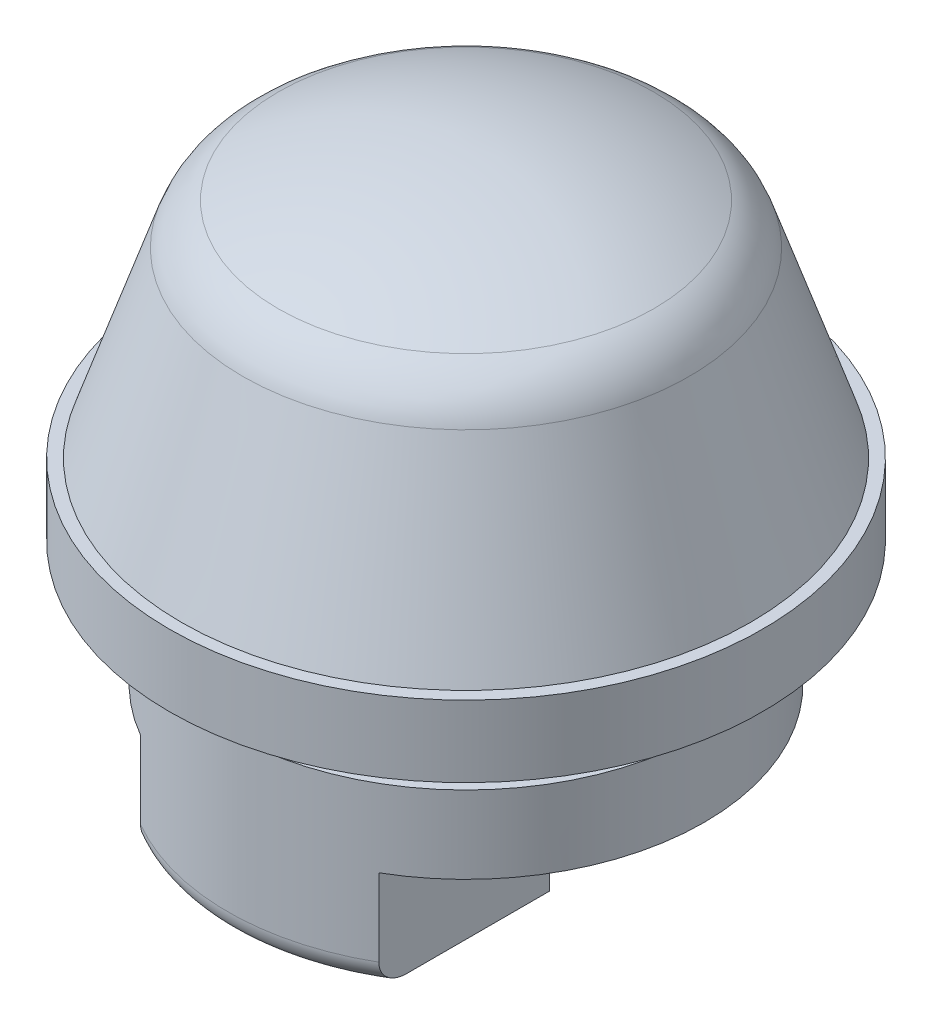
ISO-10303-21;
HEADER;
FILE_DESCRIPTION(('STEP AP214'),'2;1');
FILE_NAME('part.step','',(''),(''),'','','');
FILE_SCHEMA(('AUTOMOTIVE_DESIGN { 1 0 10303 214 1 1 1 1 }'));
ENDSEC;
DATA;
#1=APPLICATION_CONTEXT('core data for automotive mechanical design processes');
#2=APPLICATION_PROTOCOL_DEFINITION('international standard','automotive_design',2000,#1);
#3=PRODUCT_CONTEXT('',#1,'mechanical');
#4=PRODUCT('Part','Part','',(#3));
#5=PRODUCT_RELATED_PRODUCT_CATEGORY('part','',(#4));
#6=PRODUCT_DEFINITION_FORMATION('','',#4);
#7=PRODUCT_DEFINITION_CONTEXT('part definition',#1,'design');
#8=PRODUCT_DEFINITION('design','',#6,#7);
#9=PRODUCT_DEFINITION_SHAPE('','',#8);
#10=(LENGTH_UNIT() NAMED_UNIT(*) SI_UNIT(.MILLI.,.METRE.));
#11=(NAMED_UNIT(*) PLANE_ANGLE_UNIT() SI_UNIT($,.RADIAN.));
#12=(NAMED_UNIT(*) SI_UNIT($,.STERADIAN.) SOLID_ANGLE_UNIT());
#13=UNCERTAINTY_MEASURE_WITH_UNIT(LENGTH_MEASURE(1.E-05),#10,'distance_accuracy_value','');
#14=(GEOMETRIC_REPRESENTATION_CONTEXT(3) GLOBAL_UNCERTAINTY_ASSIGNED_CONTEXT((#13)) GLOBAL_UNIT_ASSIGNED_CONTEXT((#10,
#11,#12)) REPRESENTATION_CONTEXT('',''));
#15=CARTESIAN_POINT('',(0.,0.,0.));
#16=DIRECTION('',(0.,0.,1.));
#17=DIRECTION('',(1.,0.,0.));
#18=AXIS2_PLACEMENT_3D('',#15,#16,#17);
#19=CARTESIAN_POINT('',(0.,-10.5,0.));
#20=DIRECTION('',(0.,-1.,0.));
#21=DIRECTION('',(0.,0.,-1.));
#22=AXIS2_PLACEMENT_3D('',#19,#20,#21);
#23=CYLINDRICAL_SURFACE('',#22,5.6);
#24=CARTESIAN_POINT('',(0.,-16.,0.));
#25=DIRECTION('',(0.,-1.,0.));
#26=DIRECTION('',(0.,0.,-1.));
#27=AXIS2_PLACEMENT_3D('',#24,#25,#26);
#28=CIRCLE('',#27,5.6);
#29=CARTESIAN_POINT('',(-4.72863616701475,-16.,3.));
#30=VERTEX_POINT('',#29);
#31=CARTESIAN_POINT('',(4.72863616701475,-16.,3.));
#32=VERTEX_POINT('',#31);
#33=EDGE_CURVE('E416',#30,#32,#28,.F.);
#34=ORIENTED_EDGE('',*,*,#33,.F.);
#35=DIRECTION('',(0.,-1.,0.));
#36=VECTOR('',#35,1.);
#37=CARTESIAN_POINT('',(-4.72863616701475,-10.5,3.));
#38=LINE('',#37,#36);
#39=CARTESIAN_POINT('',(-4.72863616701475,-10.5,3.));
#40=VERTEX_POINT('',#39);
#41=EDGE_CURVE('E203',#40,#30,#38,.T.);
#42=ORIENTED_EDGE('',*,*,#41,.F.);
#43=CARTESIAN_POINT('',(0.,-10.5,0.));
#44=DIRECTION('',(0.,-1.,0.));
#45=DIRECTION('',(0.,0.,-1.));
#46=AXIS2_PLACEMENT_3D('',#43,#44,#45);
#47=CIRCLE('',#46,5.6);
#48=CARTESIAN_POINT('',(4.72863616701475,-10.5,3.));
#49=VERTEX_POINT('',#48);
#50=EDGE_CURVE('E414',#49,#40,#47,.T.);
#51=ORIENTED_EDGE('',*,*,#50,.F.);
#52=DIRECTION('',(0.,-1.,0.));
#53=VECTOR('',#52,1.);
#54=CARTESIAN_POINT('',(4.72863616701475,-10.5,3.));
#55=LINE('',#54,#53);
#56=EDGE_CURVE('E206',#49,#32,#55,.T.);
#57=ORIENTED_EDGE('',*,*,#56,.T.);
#58=EDGE_LOOP('',(#34,#42,#51,#57));
#59=FACE_BOUND('',#58,.T.);
#60=ADVANCED_FACE('F36',(#59),#23,.F.);
#61=CARTESIAN_POINT('',(0.,-10.5,0.));
#62=DIRECTION('',(0.,-1.,0.));
#63=DIRECTION('',(0.,0.,-1.));
#64=AXIS2_PLACEMENT_3D('',#61,#62,#63);
#65=CYLINDRICAL_SURFACE('',#64,5.6);
#66=CARTESIAN_POINT('',(0.,-16.,0.));
#67=DIRECTION('',(0.,-1.,0.));
#68=DIRECTION('',(0.,0.,-1.));
#69=AXIS2_PLACEMENT_3D('',#66,#67,#68);
#70=CIRCLE('',#69,5.6);
#71=CARTESIAN_POINT('',(4.72863616701475,-16.,-3.));
#72=VERTEX_POINT('',#71);
#73=CARTESIAN_POINT('',(-4.72863616701476,-16.,-3.));
#74=VERTEX_POINT('',#73);
#75=EDGE_CURVE('E278',#72,#74,#70,.F.);
#76=ORIENTED_EDGE('',*,*,#75,.F.);
#77=DIRECTION('',(0.,-1.,0.));
#78=VECTOR('',#77,1.);
#79=CARTESIAN_POINT('',(4.72863616701475,-10.5,-3.));
#80=LINE('',#79,#78);
#81=CARTESIAN_POINT('',(4.72863616701475,-10.5,-3.));
#82=VERTEX_POINT('',#81);
#83=EDGE_CURVE('E209',#82,#72,#80,.T.);
#84=ORIENTED_EDGE('',*,*,#83,.F.);
#85=CARTESIAN_POINT('',(0.,-10.5,0.));
#86=DIRECTION('',(0.,-1.,0.));
#87=DIRECTION('',(0.,0.,-1.));
#88=AXIS2_PLACEMENT_3D('',#85,#86,#87);
#89=CIRCLE('',#88,5.6);
#90=CARTESIAN_POINT('',(-4.72863616701476,-10.5,-3.));
#91=VERTEX_POINT('',#90);
#92=EDGE_CURVE('E406',#91,#82,#89,.T.);
#93=ORIENTED_EDGE('',*,*,#92,.F.);
#94=DIRECTION('',(0.,-1.,0.));
#95=VECTOR('',#94,1.);
#96=CARTESIAN_POINT('',(-4.72863616701476,-10.5,-3.));
#97=LINE('',#96,#95);
#98=EDGE_CURVE('E211',#91,#74,#97,.T.);
#99=ORIENTED_EDGE('',*,*,#98,.T.);
#100=EDGE_LOOP('',(#76,#84,#93,#99));
#101=FACE_BOUND('',#100,.T.);
#102=ADVANCED_FACE('F349',(#101),#65,.F.);
#103=CARTESIAN_POINT('',(0.,-19.,0.));
#104=DIRECTION('',(0.,-1.,0.));
#105=DIRECTION('',(0.,0.,-1.));
#106=AXIS2_PLACEMENT_3D('',#103,#104,#105);
#107=PLANE('',#106);
#108=DIRECTION('',(0.,0.,-1.));
#109=VECTOR('',#108,1.);
#110=CARTESIAN_POINT('',(10.,-19.,17.3205080756888));
#111=LINE('',#110,#109);
#112=CARTESIAN_POINT('',(10.,-19.,14.9666295470958));
#113=VERTEX_POINT('',#112);
#114=CARTESIAN_POINT('',(10.,-19.,3.));
#115=VERTEX_POINT('',#114);
#116=EDGE_CURVE('E233',#113,#115,#111,.T.);
#117=ORIENTED_EDGE('',*,*,#116,.F.);
#118=CARTESIAN_POINT('',(0.,-19.,0.));
#119=DIRECTION('',(0.,-1.,0.));
#120=DIRECTION('',(0.,0.,-1.));
#121=AXIS2_PLACEMENT_3D('',#118,#119,#120);
#122=CIRCLE('',#121,18.);
#123=CARTESIAN_POINT('',(-10.,-19.,14.9666295470958));
#124=VERTEX_POINT('',#123);
#125=EDGE_CURVE('E283',#113,#124,#122,.T.);
#126=ORIENTED_EDGE('',*,*,#125,.T.);
#127=DIRECTION('',(0.,0.,1.));
#128=VECTOR('',#127,1.);
#129=CARTESIAN_POINT('',(-10.,-19.,17.3205080756888));
#130=LINE('',#129,#128);
#131=CARTESIAN_POINT('',(-10.,-19.,3.));
#132=VERTEX_POINT('',#131);
#133=EDGE_CURVE('E222',#132,#124,#130,.T.);
#134=ORIENTED_EDGE('',*,*,#133,.F.);
#135=DIRECTION('',(-1.,0.,0.));
#136=VECTOR('',#135,1.);
#137=CARTESIAN_POINT('',(-4.72863616701475,-19.,3.));
#138=LINE('',#137,#136);
#139=CARTESIAN_POINT('',(-6.43506021727847,-19.,3.));
#140=VERTEX_POINT('',#139);
#141=EDGE_CURVE('E196',#140,#132,#138,.T.);
#142=ORIENTED_EDGE('',*,*,#141,.F.);
#143=CARTESIAN_POINT('',(0.,-19.,0.));
#144=DIRECTION('',(0.,-1.,0.));
#145=DIRECTION('',(0.,0.,-1.));
#146=AXIS2_PLACEMENT_3D('',#143,#144,#145);
#147=CIRCLE('',#146,7.1);
#148=CARTESIAN_POINT('',(6.43506021727847,-19.,3.));
#149=VERTEX_POINT('',#148);
#150=EDGE_CURVE('E177',#149,#140,#147,.T.);
#151=ORIENTED_EDGE('',*,*,#150,.F.);
#152=DIRECTION('',(-1.,0.,0.));
#153=VECTOR('',#152,1.);
#154=CARTESIAN_POINT('',(27.5,-19.,3.));
#155=LINE('',#154,#153);
#156=EDGE_CURVE('E192',#115,#149,#155,.T.);
#157=ORIENTED_EDGE('',*,*,#156,.F.);
#158=EDGE_LOOP('',(#117,#126,#134,#142,#151,#157));
#159=FACE_BOUND('',#158,.T.);
#160=ADVANCED_FACE('F355',(#159),#107,.T.);
#161=CARTESIAN_POINT('',(10.,-10.5,17.3205080756888));
#162=DIRECTION('',(-1.,0.,0.));
#163=DIRECTION('',(0.,0.,1.));
#164=AXIS2_PLACEMENT_3D('',#161,#162,#163);
#165=PLANE('',#164);
#166=DIRECTION('',(0.,-1.,0.));
#167=VECTOR('',#166,1.);
#168=CARTESIAN_POINT('',(10.,-10.5,17.3205080756888));
#169=LINE('',#168,#167);
#170=CARTESIAN_POINT('',(10.,-10.5,17.3205080756888));
#171=VERTEX_POINT('',#170);
#172=CARTESIAN_POINT('',(10.,-17.,17.3205080756888));
#173=VERTEX_POINT('',#172);
#174=EDGE_CURVE('E235',#171,#173,#169,.T.);
#175=ORIENTED_EDGE('',*,*,#174,.T.);
#176=CARTESIAN_POINT('',(10.,-17.,17.3205080756888));
#177=CARTESIAN_POINT('',(10.,-17.0506993268954,17.3205175378992));
#178=CARTESIAN_POINT('',(10.,-17.1013939907072,17.3182822617134));
#179=CARTESIAN_POINT('',(10.,-17.2023797154565,17.3093947392207));
#180=CARTESIAN_POINT('',(10.,-17.2526708940149,17.3027438312639));
#181=CARTESIAN_POINT('',(10.,-17.3522854324599,17.2851330264725));
#182=CARTESIAN_POINT('',(10.,-17.4016118757568,17.2741906019118));
#183=CARTESIAN_POINT('',(10.,-17.4991401993485,17.248142167546));
#184=CARTESIAN_POINT('',(10.,-17.5473420382106,17.2330360046025));
#185=CARTESIAN_POINT('',(10.,-17.689687809154,17.181743927007));
#186=CARTESIAN_POINT('',(10.,-17.7817389046122,17.139554286548));
#187=CARTESIAN_POINT('',(10.,-17.9578850603741,17.041006818573));
#188=CARTESIAN_POINT('',(10.,-18.0419738322219,16.9846379189763));
#189=CARTESIAN_POINT('',(10.,-18.2044136688514,16.8568802177375));
#190=CARTESIAN_POINT('',(10.,-18.2823026055118,16.7849052504386));
#191=CARTESIAN_POINT('',(10.,-18.4265027750317,16.6302429200286));
#192=CARTESIAN_POINT('',(10.,-18.4928128529734,16.5475544897488));
#193=CARTESIAN_POINT('',(10.,-18.620885563041,16.3628646764582));
#194=CARTESIAN_POINT('',(10.,-18.6810289325986,16.2597421672301));
#195=CARTESIAN_POINT('',(10.,-18.7857592556414,16.0457654710986));
#196=CARTESIAN_POINT('',(10.,-18.8303214649291,15.9348993185635));
#197=CARTESIAN_POINT('',(10.,-18.9118706483132,15.6836179357141));
#198=CARTESIAN_POINT('',(10.,-18.9451365918183,15.5419965673634));
#199=CARTESIAN_POINT('',(10.,-18.9891801475311,15.2557072495065));
#200=CARTESIAN_POINT('',(10.,-19.0000252254289,15.1110497668216));
#201=CARTESIAN_POINT('',(10.,-19.,14.9666295470958));
#202=B_SPLINE_CURVE_WITH_KNOTS('',3,(#176,#177,#178,#179,#180,#181,#182,#183,#184,#185,#186,
#187,#188,#189,#190,#191,#192,#193,#194,#195,#196,#197,#198,#199,#200,#201),.UNSPECIFIED.,.F.,
.F.,(4,2,2,2,2,2,2,2,2,2,2,2,4),(0.,0.152040889862174,0.304035718118439,0.455418040945435,
0.606805932219366,0.909079385160495,1.21158960944593,1.5284660221768,1.84537402328927,
2.20211611903688,2.55942220527129,2.99398210464953,3.42723247341135),.UNSPECIFIED.);
#203=EDGE_CURVE('E318',#173,#113,#202,.T.);
#204=ORIENTED_EDGE('',*,*,#203,.T.);
#205=ORIENTED_EDGE('',*,*,#116,.T.);
#206=DIRECTION('',(0.,1.,0.));
#207=VECTOR('',#206,1.);
#208=CARTESIAN_POINT('',(10.,-10.5,3.));
#209=LINE('',#208,#207);
#210=CARTESIAN_POINT('',(10.,-10.5,3.));
#211=VERTEX_POINT('',#210);
#212=EDGE_CURVE('E275',#115,#211,#209,.T.);
#213=ORIENTED_EDGE('',*,*,#212,.T.);
#214=DIRECTION('',(0.,0.,-1.));
#215=VECTOR('',#214,1.);
#216=CARTESIAN_POINT('',(10.,-10.5,17.3205080756888));
#217=LINE('',#216,#215);
#218=EDGE_CURVE('E228',#171,#211,#217,.T.);
#219=ORIENTED_EDGE('',*,*,#218,.F.);
#220=EDGE_LOOP('',(#175,#204,#205,#213,#219));
#221=FACE_BOUND('',#220,.T.);
#222=ADVANCED_FACE('F314',(#221),#165,.F.);
#223=CARTESIAN_POINT('',(-10.,-10.5,17.3205080756888));
#224=DIRECTION('',(1.,0.,0.));
#225=DIRECTION('',(0.,0.,-1.));
#226=AXIS2_PLACEMENT_3D('',#223,#224,#225);
#227=PLANE('',#226);
#228=DIRECTION('',(0.,-1.,0.));
#229=VECTOR('',#228,1.);
#230=CARTESIAN_POINT('',(-10.,-10.5,-17.3205080756888));
#231=LINE('',#230,#229);
#232=CARTESIAN_POINT('',(-10.,-10.5,-17.3205080756888));
#233=VERTEX_POINT('',#232);
#234=CARTESIAN_POINT('',(-10.,-17.,-17.3205080756888));
#235=VERTEX_POINT('',#234);
#236=EDGE_CURVE('E223',#233,#235,#231,.T.);
#237=ORIENTED_EDGE('',*,*,#236,.T.);
#238=CARTESIAN_POINT('',(-10.,-17.,-17.3205080756888));
#239=CARTESIAN_POINT('',(-10.,-17.0506993268954,-17.3205175378992));
#240=CARTESIAN_POINT('',(-10.,-17.1013939907072,-17.3182822617134));
#241=CARTESIAN_POINT('',(-10.,-17.2023797154565,-17.3093947392207));
#242=CARTESIAN_POINT('',(-10.,-17.2526708940149,-17.3027438312639));
#243=CARTESIAN_POINT('',(-10.,-17.3522854324599,-17.2851330264725));
#244=CARTESIAN_POINT('',(-10.,-17.4016118757568,-17.2741906019118));
#245=CARTESIAN_POINT('',(-10.,-17.4991401993485,-17.248142167546));
#246=CARTESIAN_POINT('',(-10.,-17.5473420382106,-17.2330360046025));
#247=CARTESIAN_POINT('',(-10.,-17.689687809154,-17.181743927007));
#248=CARTESIAN_POINT('',(-10.,-17.7817389046122,-17.139554286548));
#249=CARTESIAN_POINT('',(-10.,-17.9578850603741,-17.041006818573));
#250=CARTESIAN_POINT('',(-10.,-18.0419738322219,-16.9846379189763));
#251=CARTESIAN_POINT('',(-10.,-18.2044136688514,-16.8568802177375));
#252=CARTESIAN_POINT('',(-10.,-18.2823026055118,-16.7849052504386));
#253=CARTESIAN_POINT('',(-10.,-18.4265027750317,-16.6302429200286));
#254=CARTESIAN_POINT('',(-10.,-18.4928128529734,-16.5475544897488));
#255=CARTESIAN_POINT('',(-10.,-18.620885563041,-16.3628646764582));
#256=CARTESIAN_POINT('',(-10.,-18.6810289325986,-16.2597421672301));
#257=CARTESIAN_POINT('',(-10.,-18.7857592556414,-16.0457654710986));
#258=CARTESIAN_POINT('',(-10.,-18.8303214649291,-15.9348993185635));
#259=CARTESIAN_POINT('',(-10.,-18.9118706483132,-15.6836179357141));
#260=CARTESIAN_POINT('',(-10.,-18.9451365918183,-15.5419965673634));
#261=CARTESIAN_POINT('',(-10.,-18.9891801475311,-15.2557072495065));
#262=CARTESIAN_POINT('',(-10.,-19.0000252254289,-15.1110497668216));
#263=CARTESIAN_POINT('',(-10.,-19.,-14.9666295470958));
#264=B_SPLINE_CURVE_WITH_KNOTS('',3,(#238,#239,#240,#241,#242,#243,#244,#245,#246,#247,#248,
#249,#250,#251,#252,#253,#254,#255,#256,#257,#258,#259,#260,#261,#262,#263),.UNSPECIFIED.,.F.,
.F.,(4,2,2,2,2,2,2,2,2,2,2,2,4),(0.,0.152040889862174,0.304035718118439,0.455418040945435,
0.606805932219366,0.909079385160495,1.21158960944593,1.5284660221768,1.84537402328927,
2.20211611903688,2.55942220527129,2.99398210464953,3.42723247341135),.UNSPECIFIED.);
#265=CARTESIAN_POINT('',(-10.,-19.,-14.9666295470958));
#266=VERTEX_POINT('',#265);
#267=EDGE_CURVE('E11',#235,#266,#264,.T.);
#268=ORIENTED_EDGE('',*,*,#267,.T.);
#269=CARTESIAN_POINT('',(-10.,-19.,-3.));
#270=VERTEX_POINT('',#269);
#271=EDGE_CURVE('E220',#266,#270,#130,.T.);
#272=ORIENTED_EDGE('',*,*,#271,.T.);
#273=DIRECTION('',(0.,1.,0.));
#274=VECTOR('',#273,1.);
#275=CARTESIAN_POINT('',(-10.,-10.5,-3.));
#276=LINE('',#275,#274);
#277=CARTESIAN_POINT('',(-10.,-10.5,-3.));
#278=VERTEX_POINT('',#277);
#279=EDGE_CURVE('E270',#270,#278,#276,.T.);
#280=ORIENTED_EDGE('',*,*,#279,.T.);
#281=DIRECTION('',(0.,0.,1.));
#282=VECTOR('',#281,1.);
#283=CARTESIAN_POINT('',(-10.,-10.5,17.3205080756888));
#284=LINE('',#283,#282);
#285=EDGE_CURVE('E215',#233,#278,#284,.T.);
#286=ORIENTED_EDGE('',*,*,#285,.F.);
#287=EDGE_LOOP('',(#237,#268,#272,#280,#286));
#288=FACE_BOUND('',#287,.T.);
#289=ADVANCED_FACE('F305',(#288),#227,.F.);
#290=CARTESIAN_POINT('',(-24.9,0.,0.));
#291=DIRECTION('',(0.,1.,0.));
#292=DIRECTION('',(0.,0.,1.));
#293=AXIS2_PLACEMENT_3D('',#290,#291,#292);
#294=PLANE('',#293);
#295=CARTESIAN_POINT('',(0.,0.,0.));
#296=DIRECTION('',(0.,-1.,0.));
#297=DIRECTION('',(0.,0.,-1.));
#298=AXIS2_PLACEMENT_3D('',#295,#296,#297);
#299=CIRCLE('',#298,9.);
#300=CARTESIAN_POINT('',(0.,0.,-9.));
#301=VERTEX_POINT('',#300);
#302=EDGE_CURVE('E246',#301,#301,#299,.T.);
#303=ORIENTED_EDGE('',*,*,#302,.F.);
#304=EDGE_LOOP('',(#303));
#305=FACE_BOUND('',#304,.T.);
#306=CARTESIAN_POINT('',(0.,0.,0.));
#307=DIRECTION('',(0.,-1.,0.));
#308=DIRECTION('',(0.,0.,-1.));
#309=AXIS2_PLACEMENT_3D('',#306,#307,#308);
#310=CIRCLE('',#309,24.9);
#311=CARTESIAN_POINT('',(0.,0.,-24.9));
#312=VERTEX_POINT('',#311);
#313=EDGE_CURVE('E245',#312,#312,#310,.T.);
#314=ORIENTED_EDGE('',*,*,#313,.T.);
#315=EDGE_LOOP('',(#314));
#316=FACE_BOUND('',#315,.T.);
#317=ADVANCED_FACE('F515',(#305,#316),#294,.F.);
#318=CARTESIAN_POINT('',(0.,-6.39999999999999,0.));
#319=DIRECTION('',(0.,-1.,0.));
#320=DIRECTION('',(-1.,0.,0.));
#321=AXIS2_PLACEMENT_3D('',#318,#319,#320);
#322=SPHERICAL_SURFACE('',#321,34.9);
#323=CARTESIAN_POINT('',(0.,24.7353817362891,0.));
#324=DIRECTION('',(0.,-1.,0.));
#325=DIRECTION('',(0.,0.,-1.));
#326=AXIS2_PLACEMENT_3D('',#323,#324,#325);
#327=CIRCLE('',#326,15.7669909664321);
#328=CARTESIAN_POINT('',(0.,24.7353817362891,-15.7669909664321));
#329=VERTEX_POINT('',#328);
#330=EDGE_CURVE('E250',#329,#329,#327,.F.);
#331=ORIENTED_EDGE('',*,*,#330,.T.);
#332=EDGE_LOOP('',(#331));
#333=FACE_BOUND('',#332,.T.);
#334=ADVANCED_FACE('F520',(#333),#322,.T.);
#335=CARTESIAN_POINT('',(0.,23.5,0.));
#336=DIRECTION('',(0.,-1.,0.));
#337=DIRECTION('',(0.,0.,-1.));
#338=AXIS2_PLACEMENT_3D('',#335,#336,#337);
#339=CONICAL_SURFACE('',#338,18.,0.325175198542536);
#340=CARTESIAN_POINT('',(0.,21.299442893127,0.));
#341=DIRECTION('',(0.,1.,0.));
#342=DIRECTION('',(0.,0.,1.));
#343=AXIS2_PLACEMENT_3D('',#340,#341,#342);
#344=CIRCLE('',#343,18.7419021103172);
#345=CARTESIAN_POINT('',(0.,21.299442893127,18.7419021103172));
#346=VERTEX_POINT('',#345);
#347=EDGE_CURVE('E259',#346,#346,#344,.F.);
#348=ORIENTED_EDGE('',*,*,#347,.T.);
#349=EDGE_LOOP('',(#348));
#350=FACE_BOUND('',#349,.T.);
#351=CARTESIAN_POINT('',(0.,6.,0.));
#352=DIRECTION('',(0.,-1.,0.));
#353=DIRECTION('',(0.,0.,-1.));
#354=AXIS2_PLACEMENT_3D('',#351,#352,#353);
#355=CIRCLE('',#354,23.9);
#356=CARTESIAN_POINT('',(0.,6.,-23.9));
#357=VERTEX_POINT('',#356);
#358=EDGE_CURVE('E256',#357,#357,#355,.T.);
#359=ORIENTED_EDGE('',*,*,#358,.F.);
#360=EDGE_LOOP('',(#359));
#361=FACE_BOUND('',#360,.T.);
#362=ADVANCED_FACE('F538',(#350,#361),#339,.T.);
#363=CARTESIAN_POINT('',(-23.9,6.,0.));
#364=DIRECTION('',(0.,-1.,0.));
#365=DIRECTION('',(0.,0.,-1.));
#366=AXIS2_PLACEMENT_3D('',#363,#364,#365);
#367=PLANE('',#366);
#368=CARTESIAN_POINT('',(0.,6.,0.));
#369=DIRECTION('',(0.,-1.,0.));
#370=DIRECTION('',(0.,0.,-1.));
#371=AXIS2_PLACEMENT_3D('',#368,#369,#370);
#372=CIRCLE('',#371,24.9);
#373=CARTESIAN_POINT('',(0.,6.,-24.9));
#374=VERTEX_POINT('',#373);
#375=EDGE_CURVE('E253',#374,#374,#372,.T.);
#376=ORIENTED_EDGE('',*,*,#375,.F.);
#377=EDGE_LOOP('',(#376));
#378=FACE_BOUND('',#377,.T.);
#379=ORIENTED_EDGE('',*,*,#358,.T.);
#380=EDGE_LOOP('',(#379));
#381=FACE_BOUND('',#380,.T.);
#382=ADVANCED_FACE('F543',(#378,#381),#367,.F.);
#383=CARTESIAN_POINT('',(0.,0.,0.));
#384=DIRECTION('',(0.,-1.,0.));
#385=DIRECTION('',(0.,0.,-1.));
#386=AXIS2_PLACEMENT_3D('',#383,#384,#385);
#387=CYLINDRICAL_SURFACE('',#386,24.9);
#388=ORIENTED_EDGE('',*,*,#313,.F.);
#389=EDGE_LOOP('',(#388));
#390=FACE_BOUND('',#389,.T.);
#391=ORIENTED_EDGE('',*,*,#375,.T.);
#392=EDGE_LOOP('',(#391));
#393=FACE_BOUND('',#392,.T.);
#394=ADVANCED_FACE('F531',(#390,#393),#387,.T.);
#395=CARTESIAN_POINT('',(0.,19.3825940452366,0.));
#396=DIRECTION('',(0.,-1.,0.));
#397=DIRECTION('',(0.,0.,-1.));
#398=AXIS2_PLACEMENT_3D('',#395,#396,#397);
#399=TOROIDAL_SURFACE('',#398,13.0563334936931,6.);
#400=ORIENTED_EDGE('',*,*,#330,.F.);
#401=EDGE_LOOP('',(#400));
#402=FACE_BOUND('',#401,.T.);
#403=ORIENTED_EDGE('',*,*,#347,.F.);
#404=EDGE_LOOP('',(#403));
#405=FACE_BOUND('',#404,.T.);
#406=ADVANCED_FACE('F505',(#402,#405),#399,.T.);
#407=CARTESIAN_POINT('',(0.,-4.,0.));
#408=DIRECTION('',(0.,1.,0.));
#409=DIRECTION('',(0.,0.,1.));
#410=AXIS2_PLACEMENT_3D('',#407,#408,#409);
#411=CYLINDRICAL_SURFACE('',#410,9.);
#412=CARTESIAN_POINT('',(0.,-4.,0.));
#413=DIRECTION('',(0.,-1.,0.));
#414=DIRECTION('',(0.,0.,-1.));
#415=AXIS2_PLACEMENT_3D('',#412,#413,#414);
#416=CIRCLE('',#415,9.);
#417=CARTESIAN_POINT('',(0.,-4.,-9.));
#418=VERTEX_POINT('',#417);
#419=EDGE_CURVE('E242',#418,#418,#416,.T.);
#420=ORIENTED_EDGE('',*,*,#419,.F.);
#421=EDGE_LOOP('',(#420));
#422=FACE_BOUND('',#421,.T.);
#423=ORIENTED_EDGE('',*,*,#302,.T.);
#424=EDGE_LOOP('',(#423));
#425=FACE_BOUND('',#424,.T.);
#426=ADVANCED_FACE('F500',(#422,#425),#411,.T.);
#427=CARTESIAN_POINT('',(0.,-19.,0.));
#428=DIRECTION('',(0.,1.,0.));
#429=DIRECTION('',(0.,0.,1.));
#430=AXIS2_PLACEMENT_3D('',#427,#428,#429);
#431=CYLINDRICAL_SURFACE('',#430,20.);
#432=DIRECTION('',(0.,-1.,0.));
#433=VECTOR('',#432,1.);
#434=CARTESIAN_POINT('',(-10.,-10.5,17.3205080756888));
#435=LINE('',#434,#433);
#436=CARTESIAN_POINT('',(-10.,-10.5,17.3205080756888));
#437=VERTEX_POINT('',#436);
#438=CARTESIAN_POINT('',(-10.,-17.,17.3205080756888));
#439=VERTEX_POINT('',#438);
#440=EDGE_CURVE('E218',#437,#439,#435,.T.);
#441=ORIENTED_EDGE('',*,*,#440,.T.);
#442=CARTESIAN_POINT('',(0.,-17.,0.));
#443=DIRECTION('',(0.,-1.,0.));
#444=DIRECTION('',(0.,0.,-1.));
#445=AXIS2_PLACEMENT_3D('',#442,#443,#444);
#446=CIRCLE('',#445,20.);
#447=EDGE_CURVE('E329',#439,#173,#446,.F.);
#448=ORIENTED_EDGE('',*,*,#447,.T.);
#449=ORIENTED_EDGE('',*,*,#174,.F.);
#450=CARTESIAN_POINT('',(0.,-10.5,0.));
#451=DIRECTION('',(0.,-1.,0.));
#452=DIRECTION('',(0.,0.,-1.));
#453=AXIS2_PLACEMENT_3D('',#450,#451,#452);
#454=CIRCLE('',#453,20.);
#455=CARTESIAN_POINT('',(10.,-10.5,-17.3205080756888));
#456=VERTEX_POINT('',#455);
#457=EDGE_CURVE('E249',#456,#171,#454,.T.);
#458=ORIENTED_EDGE('',*,*,#457,.F.);
#459=DIRECTION('',(0.,-1.,0.));
#460=VECTOR('',#459,1.);
#461=CARTESIAN_POINT('',(10.,-10.5,-17.3205080756888));
#462=LINE('',#461,#460);
#463=CARTESIAN_POINT('',(10.,-17.,-17.3205080756888));
#464=VERTEX_POINT('',#463);
#465=EDGE_CURVE('E231',#456,#464,#462,.T.);
#466=ORIENTED_EDGE('',*,*,#465,.T.);
#467=CARTESIAN_POINT('',(0.,-17.,0.));
#468=DIRECTION('',(0.,-1.,0.));
#469=DIRECTION('',(0.,0.,-1.));
#470=AXIS2_PLACEMENT_3D('',#467,#468,#469);
#471=CIRCLE('',#470,20.);
#472=EDGE_CURVE('E292',#464,#235,#471,.F.);
#473=ORIENTED_EDGE('',*,*,#472,.T.);
#474=ORIENTED_EDGE('',*,*,#236,.F.);
#475=CARTESIAN_POINT('',(0.,-10.5,0.));
#476=DIRECTION('',(0.,1.,0.));
#477=DIRECTION('',(0.,0.,1.));
#478=AXIS2_PLACEMENT_3D('',#475,#476,#477);
#479=CIRCLE('',#478,20.);
#480=EDGE_CURVE('E265',#233,#437,#479,.T.);
#481=ORIENTED_EDGE('',*,*,#480,.T.);
#482=EDGE_LOOP('',(#441,#448,#449,#458,#466,#473,#474,#481));
#483=FACE_BOUND('',#482,.T.);
#484=CARTESIAN_POINT('',(0.,-4.,0.));
#485=DIRECTION('',(0.,-1.,0.));
#486=DIRECTION('',(0.,0.,-1.));
#487=AXIS2_PLACEMENT_3D('',#484,#485,#486);
#488=CIRCLE('',#487,20.);
#489=CARTESIAN_POINT('',(0.,-4.,-20.));
#490=VERTEX_POINT('',#489);
#491=EDGE_CURVE('E225',#490,#490,#488,.T.);
#492=ORIENTED_EDGE('',*,*,#491,.T.);
#493=EDGE_LOOP('',(#492));
#494=FACE_BOUND('',#493,.T.);
#495=ADVANCED_FACE('F337',(#483,#494),#431,.T.);
#496=ORIENTED_EDGE('',*,*,#271,.F.);
#497=CARTESIAN_POINT('',(0.,-19.,0.));
#498=DIRECTION('',(0.,-1.,0.));
#499=DIRECTION('',(0.,0.,-1.));
#500=AXIS2_PLACEMENT_3D('',#497,#498,#499);
#501=CIRCLE('',#500,18.);
#502=CARTESIAN_POINT('',(10.,-19.,-14.9666295470958));
#503=VERTEX_POINT('',#502);
#504=EDGE_CURVE('E328',#266,#503,#501,.T.);
#505=ORIENTED_EDGE('',*,*,#504,.T.);
#506=CARTESIAN_POINT('',(10.,-19.,-3.));
#507=VERTEX_POINT('',#506);
#508=EDGE_CURVE('E191',#507,#503,#111,.T.);
#509=ORIENTED_EDGE('',*,*,#508,.F.);
#510=DIRECTION('',(1.,0.,0.));
#511=VECTOR('',#510,1.);
#512=CARTESIAN_POINT('',(27.5,-19.,-3.));
#513=LINE('',#512,#511);
#514=CARTESIAN_POINT('',(6.43506021727847,-19.,-3.));
#515=VERTEX_POINT('',#514);
#516=EDGE_CURVE('E182',#515,#507,#513,.T.);
#517=ORIENTED_EDGE('',*,*,#516,.F.);
#518=CARTESIAN_POINT('',(-6.43506021727847,-19.,-3.));
#519=VERTEX_POINT('',#518);
#520=EDGE_CURVE('E165',#519,#515,#147,.T.);
#521=ORIENTED_EDGE('',*,*,#520,.F.);
#522=DIRECTION('',(1.,0.,0.));
#523=VECTOR('',#522,1.);
#524=CARTESIAN_POINT('',(-4.72863616701475,-19.,-3.));
#525=LINE('',#524,#523);
#526=EDGE_CURVE('E193',#270,#519,#525,.T.);
#527=ORIENTED_EDGE('',*,*,#526,.F.);
#528=EDGE_LOOP('',(#496,#505,#509,#517,#521,#527));
#529=FACE_BOUND('',#528,.T.);
#530=ADVANCED_FACE('F189',(#529),#107,.T.);
#531=CARTESIAN_POINT('',(0.,-4.,0.));
#532=DIRECTION('',(0.,-1.,0.));
#533=DIRECTION('',(0.,0.,-1.));
#534=AXIS2_PLACEMENT_3D('',#531,#532,#533);
#535=PLANE('',#534);
#536=ORIENTED_EDGE('',*,*,#419,.T.);
#537=EDGE_LOOP('',(#536));
#538=FACE_BOUND('',#537,.T.);
#539=ORIENTED_EDGE('',*,*,#491,.F.);
#540=EDGE_LOOP('',(#539));
#541=FACE_BOUND('',#540,.T.);
#542=ADVANCED_FACE('F312',(#538,#541),#535,.F.);
#543=ORIENTED_EDGE('',*,*,#508,.T.);
#544=CARTESIAN_POINT('',(10.,-19.,-14.9666295470958));
#545=CARTESIAN_POINT('',(10.,-18.9999845867152,-15.0516732712899));
#546=CARTESIAN_POINT('',(10.,-18.996246020805,-15.1366669620725));
#547=CARTESIAN_POINT('',(10.,-18.9811419539525,-15.3060669001933));
#548=CARTESIAN_POINT('',(10.,-18.9697678818686,-15.3904723795401));
#549=CARTESIAN_POINT('',(10.,-18.9238581020736,-15.6421975081316));
#550=CARTESIAN_POINT('',(10.,-18.877533073294,-15.8076016317386));
#551=CARTESIAN_POINT('',(10.,-18.7676124553637,-16.0880366468541));
#552=CARTESIAN_POINT('',(10.,-18.7106950567304,-16.2057275051022));
#553=CARTESIAN_POINT('',(10.,-18.5782872405554,-16.4300329772546));
#554=CARTESIAN_POINT('',(10.,-18.5028310060401,-16.5366674686999));
#555=CARTESIAN_POINT('',(10.,-18.3333541973957,-16.7355837210955));
#556=CARTESIAN_POINT('',(10.,-18.2391948897994,-16.827748402947));
#557=CARTESIAN_POINT('',(10.,-18.034582765225,-16.9919762652033));
#558=CARTESIAN_POINT('',(10.,-17.9241326524196,-17.0640427760516));
#559=CARTESIAN_POINT('',(10.,-17.7062117232476,-17.1753687710706));
#560=CARTESIAN_POINT('',(10.,-17.6003446231462,-17.2177402858121));
#561=CARTESIAN_POINT('',(10.,-17.4372002865831,-17.265568756495));
#562=CARTESIAN_POINT('',(10.,-17.3821335458399,-17.2788864159564));
#563=CARTESIAN_POINT('',(10.,-17.2709818889601,-17.3001313314973));
#564=CARTESIAN_POINT('',(10.,-17.2148977304779,-17.3080624422877));
#565=CARTESIAN_POINT('',(10.,-17.1322045485154,-17.3156600586631));
#566=CARTESIAN_POINT('',(10.,-17.1057761295877,-17.3174787063067));
#567=CARTESIAN_POINT('',(10.,-17.0529000288164,-17.3199018179625));
#568=CARTESIAN_POINT('',(10.,-17.0264524231398,-17.3205079442785));
#569=CARTESIAN_POINT('',(10.,-17.,-17.3205080756888));
#570=B_SPLINE_CURVE_WITH_KNOTS('',3,(#544,#545,#546,#547,#548,#549,#550,#551,#552,#553,#554,
#555,#556,#557,#558,#559,#560,#561,#562,#563,#564,#565,#566,#567,#568,#569),.UNSPECIFIED.,.F.,
.F.,(4,2,2,2,2,2,2,2,2,2,2,2,4),(0.,0.254940424359407,0.510167508497355,1.02187610161604,
1.41253113895616,1.80247119872423,2.19541966475816,2.58830297703844,2.92825007935739,
3.09799450875874,3.26761733764622,3.34706707373633,3.42640781351569),.UNSPECIFIED.);
#571=EDGE_CURVE('E50',#503,#464,#570,.T.);
#572=ORIENTED_EDGE('',*,*,#571,.T.);
#573=ORIENTED_EDGE('',*,*,#465,.F.);
#574=CARTESIAN_POINT('',(10.,-10.5,-3.));
#575=VERTEX_POINT('',#574);
#576=EDGE_CURVE('E232',#575,#456,#217,.T.);
#577=ORIENTED_EDGE('',*,*,#576,.F.);
#578=DIRECTION('',(0.,-1.,0.));
#579=VECTOR('',#578,1.);
#580=CARTESIAN_POINT('',(10.,-10.5,-3.));
#581=LINE('',#580,#579);
#582=EDGE_CURVE('E273',#575,#507,#581,.T.);
#583=ORIENTED_EDGE('',*,*,#582,.T.);
#584=EDGE_LOOP('',(#543,#572,#573,#577,#583));
#585=FACE_BOUND('',#584,.T.);
#586=ADVANCED_FACE('F307',(#585),#165,.F.);
#587=CARTESIAN_POINT('',(0.,-10.5,0.));
#588=DIRECTION('',(0.,1.,0.));
#589=DIRECTION('',(0.,0.,1.));
#590=AXIS2_PLACEMENT_3D('',#587,#588,#589);
#591=PLANE('',#590);
#592=CARTESIAN_POINT('',(-10.,-10.5,3.));
#593=VERTEX_POINT('',#592);
#594=EDGE_CURVE('E219',#593,#437,#284,.T.);
#595=ORIENTED_EDGE('',*,*,#594,.T.);
#596=ORIENTED_EDGE('',*,*,#480,.F.);
#597=ORIENTED_EDGE('',*,*,#285,.T.);
#598=DIRECTION('',(1.,0.,0.));
#599=VECTOR('',#598,1.);
#600=CARTESIAN_POINT('',(-4.72863616701475,-10.5,-3.));
#601=LINE('',#600,#599);
#602=EDGE_CURVE('E202',#278,#91,#601,.T.);
#603=ORIENTED_EDGE('',*,*,#602,.T.);
#604=ORIENTED_EDGE('',*,*,#92,.T.);
#605=DIRECTION('',(1.,0.,0.));
#606=VECTOR('',#605,1.);
#607=CARTESIAN_POINT('',(27.5,-10.5,-3.));
#608=LINE('',#607,#606);
#609=EDGE_CURVE('E405',#82,#575,#608,.T.);
#610=ORIENTED_EDGE('',*,*,#609,.T.);
#611=ORIENTED_EDGE('',*,*,#576,.T.);
#612=ORIENTED_EDGE('',*,*,#457,.T.);
#613=ORIENTED_EDGE('',*,*,#218,.T.);
#614=DIRECTION('',(-1.,0.,0.));
#615=VECTOR('',#614,1.);
#616=CARTESIAN_POINT('',(27.5,-10.5,3.));
#617=LINE('',#616,#615);
#618=EDGE_CURVE('E400',#211,#49,#617,.T.);
#619=ORIENTED_EDGE('',*,*,#618,.T.);
#620=ORIENTED_EDGE('',*,*,#50,.T.);
#621=DIRECTION('',(-1.,0.,0.));
#622=VECTOR('',#621,1.);
#623=CARTESIAN_POINT('',(-4.72863616701475,-10.5,3.));
#624=LINE('',#623,#622);
#625=EDGE_CURVE('E214',#40,#593,#624,.T.);
#626=ORIENTED_EDGE('',*,*,#625,.T.);
#627=EDGE_LOOP('',(#595,#596,#597,#603,#604,#610,#611,#612,#613,#619,#620,#626));
#628=FACE_BOUND('',#627,.T.);
#629=ADVANCED_FACE('F303',(#628),#591,.F.);
#630=ORIENTED_EDGE('',*,*,#133,.T.);
#631=CARTESIAN_POINT('',(-10.,-19.,14.9666295470958));
#632=CARTESIAN_POINT('',(-10.,-18.9999845867152,15.0516732712899));
#633=CARTESIAN_POINT('',(-10.,-18.996246020805,15.1366669620725));
#634=CARTESIAN_POINT('',(-10.,-18.9811419539525,15.3060669001933));
#635=CARTESIAN_POINT('',(-10.,-18.9697678818686,15.3904723795401));
#636=CARTESIAN_POINT('',(-10.,-18.9238581020736,15.6421975081316));
#637=CARTESIAN_POINT('',(-10.,-18.877533073294,15.8076016317386));
#638=CARTESIAN_POINT('',(-10.,-18.7676124553637,16.0880366468541));
#639=CARTESIAN_POINT('',(-10.,-18.7106950567304,16.2057275051022));
#640=CARTESIAN_POINT('',(-10.,-18.5782872405554,16.4300329772546));
#641=CARTESIAN_POINT('',(-10.,-18.5028310060401,16.5366674686999));
#642=CARTESIAN_POINT('',(-10.,-18.3333541973957,16.7355837210955));
#643=CARTESIAN_POINT('',(-10.,-18.2391948897994,16.827748402947));
#644=CARTESIAN_POINT('',(-10.,-18.034582765225,16.9919762652033));
#645=CARTESIAN_POINT('',(-10.,-17.9241326524196,17.0640427760516));
#646=CARTESIAN_POINT('',(-10.,-17.7062117232476,17.1753687710706));
#647=CARTESIAN_POINT('',(-10.,-17.6003446231462,17.2177402858121));
#648=CARTESIAN_POINT('',(-10.,-17.4372002865831,17.265568756495));
#649=CARTESIAN_POINT('',(-10.,-17.3821335458399,17.2788864159564));
#650=CARTESIAN_POINT('',(-10.,-17.2709818889601,17.3001313314973));
#651=CARTESIAN_POINT('',(-10.,-17.2148977304779,17.3080624422877));
#652=CARTESIAN_POINT('',(-10.,-17.1322045485154,17.3156600586631));
#653=CARTESIAN_POINT('',(-10.,-17.1057761295877,17.3174787063067));
#654=CARTESIAN_POINT('',(-10.,-17.0529000288164,17.3199018179625));
#655=CARTESIAN_POINT('',(-10.,-17.0264524231398,17.3205079442785));
#656=CARTESIAN_POINT('',(-10.,-17.,17.3205080756888));
#657=B_SPLINE_CURVE_WITH_KNOTS('',3,(#631,#632,#633,#634,#635,#636,#637,#638,#639,#640,#641,
#642,#643,#644,#645,#646,#647,#648,#649,#650,#651,#652,#653,#654,#655,#656),.UNSPECIFIED.,.F.,
.F.,(4,2,2,2,2,2,2,2,2,2,2,2,4),(0.,0.254940424359407,0.510167508497355,1.02187610161604,
1.41253113895616,1.80247119872423,2.19541966475816,2.58830297703844,2.92825007935739,
3.09799450875874,3.26761733764622,3.34706707373633,3.42640781351569),.UNSPECIFIED.);
#658=EDGE_CURVE('E286',#124,#439,#657,.T.);
#659=ORIENTED_EDGE('',*,*,#658,.T.);
#660=ORIENTED_EDGE('',*,*,#440,.F.);
#661=ORIENTED_EDGE('',*,*,#594,.F.);
#662=DIRECTION('',(0.,-1.,0.));
#663=VECTOR('',#662,1.);
#664=CARTESIAN_POINT('',(-10.,-10.5,3.));
#665=LINE('',#664,#663);
#666=EDGE_CURVE('E267',#593,#132,#665,.T.);
#667=ORIENTED_EDGE('',*,*,#666,.T.);
#668=EDGE_LOOP('',(#630,#659,#660,#661,#667));
#669=FACE_BOUND('',#668,.T.);
#670=ADVANCED_FACE('F297',(#669),#227,.F.);
#671=CARTESIAN_POINT('',(27.5,-10.5,3.));
#672=DIRECTION('',(0.,0.,1.));
#673=DIRECTION('',(1.,0.,0.));
#674=AXIS2_PLACEMENT_3D('',#671,#672,#673);
#675=PLANE('',#674);
#676=ORIENTED_EDGE('',*,*,#156,.T.);
#677=DIRECTION('',(0.,-1.,0.));
#678=VECTOR('',#677,1.);
#679=CARTESIAN_POINT('',(6.43506021727847,-16.,3.));
#680=LINE('',#679,#678);
#681=CARTESIAN_POINT('',(6.43506021727847,-16.,3.));
#682=VERTEX_POINT('',#681);
#683=EDGE_CURVE('E186',#149,#682,#680,.F.);
#684=ORIENTED_EDGE('',*,*,#683,.T.);
#685=DIRECTION('',(1.,0.,0.));
#686=VECTOR('',#685,1.);
#687=CARTESIAN_POINT('',(27.5,-16.,3.));
#688=LINE('',#687,#686);
#689=EDGE_CURVE('E420',#32,#682,#688,.T.);
#690=ORIENTED_EDGE('',*,*,#689,.F.);
#691=ORIENTED_EDGE('',*,*,#56,.F.);
#692=ORIENTED_EDGE('',*,*,#618,.F.);
#693=ORIENTED_EDGE('',*,*,#212,.F.);
#694=EDGE_LOOP('',(#676,#684,#690,#691,#692,#693));
#695=FACE_BOUND('',#694,.T.);
#696=ADVANCED_FACE('F302',(#695),#675,.F.);
#697=CARTESIAN_POINT('',(27.5,-10.5,-3.));
#698=DIRECTION('',(0.,0.,-1.));
#699=DIRECTION('',(-1.,0.,0.));
#700=AXIS2_PLACEMENT_3D('',#697,#698,#699);
#701=PLANE('',#700);
#702=DIRECTION('',(-1.,0.,0.));
#703=VECTOR('',#702,1.);
#704=CARTESIAN_POINT('',(27.5,-16.,-3.));
#705=LINE('',#704,#703);
#706=CARTESIAN_POINT('',(6.43506021727847,-16.,-3.));
#707=VERTEX_POINT('',#706);
#708=EDGE_CURVE('E185',#707,#72,#705,.T.);
#709=ORIENTED_EDGE('',*,*,#708,.F.);
#710=DIRECTION('',(0.,-1.,0.));
#711=VECTOR('',#710,1.);
#712=CARTESIAN_POINT('',(6.43506021727847,-16.,-3.));
#713=LINE('',#712,#711);
#714=EDGE_CURVE('E169',#707,#515,#713,.T.);
#715=ORIENTED_EDGE('',*,*,#714,.T.);
#716=ORIENTED_EDGE('',*,*,#516,.T.);
#717=ORIENTED_EDGE('',*,*,#582,.F.);
#718=ORIENTED_EDGE('',*,*,#609,.F.);
#719=ORIENTED_EDGE('',*,*,#83,.T.);
#720=EDGE_LOOP('',(#709,#715,#716,#717,#718,#719));
#721=FACE_BOUND('',#720,.T.);
#722=ADVANCED_FACE('F181',(#721),#701,.F.);
#723=CARTESIAN_POINT('',(-4.72863616701475,-10.5,-3.));
#724=DIRECTION('',(0.,0.,-1.));
#725=DIRECTION('',(-1.,0.,0.));
#726=AXIS2_PLACEMENT_3D('',#723,#724,#725);
#727=PLANE('',#726);
#728=ORIENTED_EDGE('',*,*,#526,.T.);
#729=DIRECTION('',(0.,-1.,0.));
#730=VECTOR('',#729,1.);
#731=CARTESIAN_POINT('',(-6.43506021727847,-16.,-3.));
#732=LINE('',#731,#730);
#733=CARTESIAN_POINT('',(-6.43506021727847,-16.,-3.));
#734=VERTEX_POINT('',#733);
#735=EDGE_CURVE('E172',#519,#734,#732,.F.);
#736=ORIENTED_EDGE('',*,*,#735,.T.);
#737=DIRECTION('',(-1.,0.,0.));
#738=VECTOR('',#737,1.);
#739=CARTESIAN_POINT('',(-4.72863616701475,-16.,-3.));
#740=LINE('',#739,#738);
#741=EDGE_CURVE('E427',#74,#734,#740,.T.);
#742=ORIENTED_EDGE('',*,*,#741,.F.);
#743=ORIENTED_EDGE('',*,*,#98,.F.);
#744=ORIENTED_EDGE('',*,*,#602,.F.);
#745=ORIENTED_EDGE('',*,*,#279,.F.);
#746=EDGE_LOOP('',(#728,#736,#742,#743,#744,#745));
#747=FACE_BOUND('',#746,.T.);
#748=ADVANCED_FACE('F367',(#747),#727,.F.);
#749=CARTESIAN_POINT('',(-4.72863616701475,-10.5,3.));
#750=DIRECTION('',(0.,0.,1.));
#751=DIRECTION('',(1.,0.,0.));
#752=AXIS2_PLACEMENT_3D('',#749,#750,#751);
#753=PLANE('',#752);
#754=DIRECTION('',(1.,0.,0.));
#755=VECTOR('',#754,1.);
#756=CARTESIAN_POINT('',(-4.72863616701475,-16.,3.));
#757=LINE('',#756,#755);
#758=CARTESIAN_POINT('',(-6.43506021727847,-16.,3.));
#759=VERTEX_POINT('',#758);
#760=EDGE_CURVE('E417',#759,#30,#757,.T.);
#761=ORIENTED_EDGE('',*,*,#760,.F.);
#762=DIRECTION('',(0.,-1.,0.));
#763=VECTOR('',#762,1.);
#764=CARTESIAN_POINT('',(-6.43506021727847,-16.,3.));
#765=LINE('',#764,#763);
#766=EDGE_CURVE('E280',#759,#140,#765,.T.);
#767=ORIENTED_EDGE('',*,*,#766,.T.);
#768=ORIENTED_EDGE('',*,*,#141,.T.);
#769=ORIENTED_EDGE('',*,*,#666,.F.);
#770=ORIENTED_EDGE('',*,*,#625,.F.);
#771=ORIENTED_EDGE('',*,*,#41,.T.);
#772=EDGE_LOOP('',(#761,#767,#768,#769,#770,#771));
#773=FACE_BOUND('',#772,.T.);
#774=ADVANCED_FACE('F361',(#773),#753,.F.);
#775=CARTESIAN_POINT('',(0.,-16.,0.));
#776=DIRECTION('',(0.,-1.,0.));
#777=DIRECTION('',(0.,0.,-1.));
#778=AXIS2_PLACEMENT_3D('',#775,#776,#777);
#779=PLANE('',#778);
#780=ORIENTED_EDGE('',*,*,#708,.T.);
#781=ORIENTED_EDGE('',*,*,#75,.T.);
#782=ORIENTED_EDGE('',*,*,#741,.T.);
#783=CARTESIAN_POINT('',(0.,-16.,0.));
#784=DIRECTION('',(0.,-1.,0.));
#785=DIRECTION('',(0.,0.,-1.));
#786=AXIS2_PLACEMENT_3D('',#783,#784,#785);
#787=CIRCLE('',#786,7.1);
#788=EDGE_CURVE('E395',#734,#707,#787,.T.);
#789=ORIENTED_EDGE('',*,*,#788,.T.);
#790=EDGE_LOOP('',(#780,#781,#782,#789));
#791=FACE_BOUND('',#790,.T.);
#792=ADVANCED_FACE('F373',(#791),#779,.T.);
#793=CARTESIAN_POINT('',(0.,-16.,0.));
#794=DIRECTION('',(0.,-1.,0.));
#795=DIRECTION('',(0.,0.,-1.));
#796=AXIS2_PLACEMENT_3D('',#793,#794,#795);
#797=CYLINDRICAL_SURFACE('',#796,7.1);
#798=ORIENTED_EDGE('',*,*,#788,.F.);
#799=ORIENTED_EDGE('',*,*,#735,.F.);
#800=ORIENTED_EDGE('',*,*,#520,.T.);
#801=ORIENTED_EDGE('',*,*,#714,.F.);
#802=EDGE_LOOP('',(#798,#799,#800,#801));
#803=FACE_BOUND('',#802,.T.);
#804=ADVANCED_FACE('F168',(#803),#797,.F.);
#805=ORIENTED_EDGE('',*,*,#150,.T.);
#806=ORIENTED_EDGE('',*,*,#766,.F.);
#807=EDGE_CURVE('E428',#682,#759,#787,.T.);
#808=ORIENTED_EDGE('',*,*,#807,.F.);
#809=ORIENTED_EDGE('',*,*,#683,.F.);
#810=EDGE_LOOP('',(#805,#806,#808,#809));
#811=FACE_BOUND('',#810,.T.);
#812=ADVANCED_FACE('F432',(#811),#797,.F.);
#813=ORIENTED_EDGE('',*,*,#689,.T.);
#814=ORIENTED_EDGE('',*,*,#807,.T.);
#815=ORIENTED_EDGE('',*,*,#760,.T.);
#816=ORIENTED_EDGE('',*,*,#33,.T.);
#817=EDGE_LOOP('',(#813,#814,#815,#816));
#818=FACE_BOUND('',#817,.T.);
#819=ADVANCED_FACE('F346',(#818),#779,.T.);
#820=CARTESIAN_POINT('',(0.,-17.,0.));
#821=DIRECTION('',(0.,-1.,0.));
#822=DIRECTION('',(0.,0.,-1.));
#823=AXIS2_PLACEMENT_3D('',#820,#821,#822);
#824=TOROIDAL_SURFACE('',#823,18.,2.);
#825=ORIENTED_EDGE('',*,*,#203,.F.);
#826=ORIENTED_EDGE('',*,*,#447,.F.);
#827=ORIENTED_EDGE('',*,*,#658,.F.);
#828=ORIENTED_EDGE('',*,*,#125,.F.);
#829=EDGE_LOOP('',(#825,#826,#827,#828));
#830=FACE_BOUND('',#829,.T.);
#831=ADVANCED_FACE('F294',(#830),#824,.T.);
#832=CARTESIAN_POINT('',(0.,-17.,0.));
#833=DIRECTION('',(0.,-1.,0.));
#834=DIRECTION('',(0.,0.,-1.));
#835=AXIS2_PLACEMENT_3D('',#832,#833,#834);
#836=TOROIDAL_SURFACE('',#835,18.,2.);
#837=ORIENTED_EDGE('',*,*,#267,.F.);
#838=ORIENTED_EDGE('',*,*,#472,.F.);
#839=ORIENTED_EDGE('',*,*,#571,.F.);
#840=ORIENTED_EDGE('',*,*,#504,.F.);
#841=EDGE_LOOP('',(#837,#838,#839,#840));
#842=FACE_BOUND('',#841,.T.);
#843=ADVANCED_FACE('F38',(#842),#836,.T.);
#844=CLOSED_SHELL('',(#60,#102,#160,#222,#289,#317,#334,#362,#382,#394,#406,#426,#495,#530,#542,
#586,#629,#670,#696,#722,#748,#774,#792,#804,#812,#819,#831,#843));
#845=MANIFOLD_SOLID_BREP('B2',#844);
#846=ADVANCED_BREP_SHAPE_REPRESENTATION('',(#18,#845),#14);
#847=SHAPE_DEFINITION_REPRESENTATION(#9,#846);
ENDSEC;
END-ISO-10303-21;
